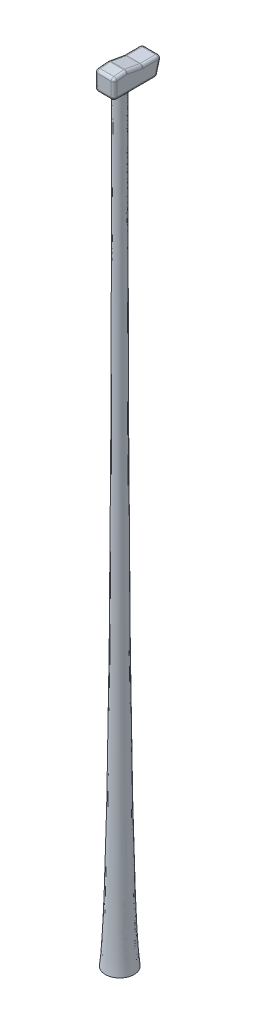
ISO-10303-21;
HEADER;
FILE_DESCRIPTION(('STEP AP214'),'2;1');
FILE_NAME('part.step','',(''),(''),'','','');
FILE_SCHEMA(('AUTOMOTIVE_DESIGN { 1 0 10303 214 1 1 1 1 }'));
ENDSEC;
DATA;
#1=APPLICATION_CONTEXT('core data for automotive mechanical design processes');
#2=APPLICATION_PROTOCOL_DEFINITION('international standard','automotive_design',2000,#1);
#3=PRODUCT_CONTEXT('',#1,'mechanical');
#4=PRODUCT('Part','Part','',(#3));
#5=PRODUCT_RELATED_PRODUCT_CATEGORY('part','',(#4));
#6=PRODUCT_DEFINITION_FORMATION('','',#4);
#7=PRODUCT_DEFINITION_CONTEXT('part definition',#1,'design');
#8=PRODUCT_DEFINITION('design','',#6,#7);
#9=PRODUCT_DEFINITION_SHAPE('','',#8);
#10=(LENGTH_UNIT() NAMED_UNIT(*) SI_UNIT(.MILLI.,.METRE.));
#11=(NAMED_UNIT(*) PLANE_ANGLE_UNIT() SI_UNIT($,.RADIAN.));
#12=(NAMED_UNIT(*) SI_UNIT($,.STERADIAN.) SOLID_ANGLE_UNIT());
#13=UNCERTAINTY_MEASURE_WITH_UNIT(LENGTH_MEASURE(1.E-05),#10,'distance_accuracy_value','');
#14=(GEOMETRIC_REPRESENTATION_CONTEXT(3) GLOBAL_UNCERTAINTY_ASSIGNED_CONTEXT((#13)) GLOBAL_UNIT_ASSIGNED_CONTEXT((#10,
#11,#12)) REPRESENTATION_CONTEXT('',''));
#15=CARTESIAN_POINT('',(0.,0.,0.));
#16=DIRECTION('',(0.,0.,1.));
#17=DIRECTION('',(1.,0.,0.));
#18=AXIS2_PLACEMENT_3D('',#15,#16,#17);
#19=CARTESIAN_POINT('',(-1000.,-999.999999999999,-5010.41122648025));
#20=DIRECTION('',(0.,-1.,0.));
#21=DIRECTION('',(0.,0.,-1.));
#22=AXIS2_PLACEMENT_3D('',#19,#20,#21);
#23=PLANE('',#22);
#24=CARTESIAN_POINT('',(0.,-1000.,-2100.));
#25=DIRECTION('',(0.,-1.,0.));
#26=DIRECTION('',(0.,0.,-1.));
#27=AXIS2_PLACEMENT_3D('',#24,#25,#26);
#28=CIRCLE('',#27,700.);
#29=CARTESIAN_POINT('',(700.,-1000.,-2100.));
#30=VERTEX_POINT('',#29);
#31=CARTESIAN_POINT('',(-700.,-1000.,-2100.));
#32=VERTEX_POINT('',#31);
#33=EDGE_CURVE('E190',#30,#32,#28,.T.);
#34=ORIENTED_EDGE('',*,*,#33,.F.);
#35=DIRECTION('',(0.,0.,-1.));
#36=VECTOR('',#35,1.);
#37=CARTESIAN_POINT('',(700.,-1000.,-500.));
#38=LINE('',#37,#36);
#39=CARTESIAN_POINT('',(700.,-1000.,-800.));
#40=VERTEX_POINT('',#39);
#41=EDGE_CURVE('E178',#30,#40,#38,.F.);
#42=ORIENTED_EDGE('',*,*,#41,.T.);
#43=DIRECTION('',(1.,0.,0.));
#44=VECTOR('',#43,1.);
#45=CARTESIAN_POINT('',(-1000.,-1000.,-800.));
#46=LINE('',#45,#44);
#47=CARTESIAN_POINT('',(-700.,-1000.,-800.));
#48=VERTEX_POINT('',#47);
#49=EDGE_CURVE('E177',#40,#48,#46,.F.);
#50=ORIENTED_EDGE('',*,*,#49,.T.);
#51=DIRECTION('',(0.,0.,-1.));
#52=VECTOR('',#51,1.);
#53=CARTESIAN_POINT('',(-700.,-999.999999999999,-5010.41122648025));
#54=LINE('',#53,#52);
#55=EDGE_CURVE('E192',#48,#32,#54,.T.);
#56=ORIENTED_EDGE('',*,*,#55,.T.);
#57=EDGE_LOOP('',(#34,#42,#50,#56));
#58=FACE_BOUND('',#57,.T.);
#59=ADVANCED_FACE('F33',(#58),#23,.T.);
#60=EDGE_CURVE('E48',#32,#30,#28,.T.);
#61=ORIENTED_EDGE('',*,*,#60,.F.);
#62=CARTESIAN_POINT('',(-700.,-999.999999999999,-4780.21313008656));
#63=VERTEX_POINT('',#62);
#64=EDGE_CURVE('E205',#32,#63,#54,.T.);
#65=ORIENTED_EDGE('',*,*,#64,.T.);
#66=DIRECTION('',(1.,0.,0.));
#67=VECTOR('',#66,1.);
#68=CARTESIAN_POINT('',(-1000.,-999.999999999999,-4780.21313008656));
#69=LINE('',#68,#67);
#70=CARTESIAN_POINT('',(700.,-999.999999999999,-4780.21313008656));
#71=VERTEX_POINT('',#70);
#72=EDGE_CURVE('E174',#63,#71,#69,.T.);
#73=ORIENTED_EDGE('',*,*,#72,.T.);
#74=EDGE_CURVE('E170',#71,#30,#38,.F.);
#75=ORIENTED_EDGE('',*,*,#74,.T.);
#76=EDGE_LOOP('',(#61,#65,#73,#75));
#77=FACE_BOUND('',#76,.T.);
#78=ADVANCED_FACE('F172',(#77),#23,.T.);
#79=CARTESIAN_POINT('',(-1000.,-1000.,-500.));
#80=DIRECTION('',(0.,0.,1.));
#81=DIRECTION('',(1.,0.,0.));
#82=AXIS2_PLACEMENT_3D('',#79,#80,#81);
#83=PLANE('',#82);
#84=DIRECTION('',(1.,0.,0.));
#85=VECTOR('',#84,1.);
#86=CARTESIAN_POINT('',(-1000.,725.100647794772,-500.));
#87=LINE('',#86,#85);
#88=CARTESIAN_POINT('',(700.,725.100647794772,-500.));
#89=VERTEX_POINT('',#88);
#90=CARTESIAN_POINT('',(-700.,725.100647794772,-500.));
#91=VERTEX_POINT('',#90);
#92=EDGE_CURVE('E233',#89,#91,#87,.F.);
#93=ORIENTED_EDGE('',*,*,#92,.T.);
#94=DIRECTION('',(0.,-1.,0.));
#95=VECTOR('',#94,1.);
#96=CARTESIAN_POINT('',(-700.,-1000.,-500.));
#97=LINE('',#96,#95);
#98=CARTESIAN_POINT('',(-700.,-700.,-500.));
#99=VERTEX_POINT('',#98);
#100=EDGE_CURVE('E239',#91,#99,#97,.T.);
#101=ORIENTED_EDGE('',*,*,#100,.T.);
#102=DIRECTION('',(1.,0.,0.));
#103=VECTOR('',#102,1.);
#104=CARTESIAN_POINT('',(-1000.,-700.,-500.));
#105=LINE('',#104,#103);
#106=CARTESIAN_POINT('',(700.,-700.,-500.));
#107=VERTEX_POINT('',#106);
#108=EDGE_CURVE('E237',#99,#107,#105,.T.);
#109=ORIENTED_EDGE('',*,*,#108,.T.);
#110=DIRECTION('',(0.,-1.,0.));
#111=VECTOR('',#110,1.);
#112=CARTESIAN_POINT('',(700.,1000.,-500.));
#113=LINE('',#112,#111);
#114=EDGE_CURVE('E235',#107,#89,#113,.F.);
#115=ORIENTED_EDGE('',*,*,#114,.T.);
#116=EDGE_LOOP('',(#93,#101,#109,#115));
#117=FACE_BOUND('',#116,.T.);
#118=ADVANCED_FACE('F404',(#117),#83,.T.);
#119=CARTESIAN_POINT('',(-1000.,1000.,-500.));
#120=DIRECTION('',(0.,0.996194698091746,0.0871557427476548));
#121=DIRECTION('',(0.,-0.0871557427476548,0.996194698091746));
#122=AXIS2_PLACEMENT_3D('',#119,#120,#121);
#123=PLANE('',#122);
#124=DIRECTION('',(1.,0.,0.));
#125=VECTOR('',#124,1.);
#126=CARTESIAN_POINT('',(-1000.,1114.66741439645,-1810.65454397387));
#127=LINE('',#126,#125);
#128=CARTESIAN_POINT('',(700.,1114.66741439645,-1810.65454397387));
#129=VERTEX_POINT('',#128);
#130=CARTESIAN_POINT('',(-700.,1114.66741439645,-1810.65454397387));
#131=VERTEX_POINT('',#130);
#132=EDGE_CURVE('E56',#129,#131,#127,.F.);
#133=ORIENTED_EDGE('',*,*,#132,.T.);
#134=DIRECTION('',(0.,-0.0871557427476548,0.996194698091746));
#135=VECTOR('',#134,1.);
#136=CARTESIAN_POINT('',(-700.,1000.,-500.));
#137=LINE('',#136,#135);
#138=CARTESIAN_POINT('',(-700.,1023.9590572223,-773.853277175704));
#139=VERTEX_POINT('',#138);
#140=EDGE_CURVE('E281',#131,#139,#137,.T.);
#141=ORIENTED_EDGE('',*,*,#140,.T.);
#142=DIRECTION('',(1.,0.,0.));
#143=VECTOR('',#142,1.);
#144=CARTESIAN_POINT('',(-1000.,1023.9590572223,-773.853277175704));
#145=LINE('',#144,#143);
#146=CARTESIAN_POINT('',(700.,1023.9590572223,-773.853277175704));
#147=VERTEX_POINT('',#146);
#148=EDGE_CURVE('E276',#139,#147,#145,.T.);
#149=ORIENTED_EDGE('',*,*,#148,.T.);
#150=DIRECTION('',(0.,-0.0871557427476548,0.996194698091746));
#151=VECTOR('',#150,1.);
#152=CARTESIAN_POINT('',(700.,1118.10969575999,-1850.));
#153=LINE('',#152,#151);
#154=EDGE_CURVE('E278',#147,#129,#153,.F.);
#155=ORIENTED_EDGE('',*,*,#154,.T.);
#156=EDGE_LOOP('',(#133,#141,#149,#155));
#157=FACE_BOUND('',#156,.T.);
#158=ADVANCED_FACE('F408',(#157),#123,.T.);
#159=CARTESIAN_POINT('',(-1000.,1118.10969575999,-1850.));
#160=DIRECTION('',(0.,0.984807753012208,-0.173648177666934));
#161=DIRECTION('',(0.,0.173648177666934,0.984807753012208));
#162=AXIS2_PLACEMENT_3D('',#159,#160,#161);
#163=PLANE('',#162);
#164=DIRECTION('',(1.,0.,0.));
#165=VECTOR('',#164,1.);
#166=CARTESIAN_POINT('',(-1000.,831.727851687357,-3474.1521457577));
#167=LINE('',#166,#165);
#168=CARTESIAN_POINT('',(700.,831.727851687357,-3474.1521457577));
#169=VERTEX_POINT('',#168);
#170=CARTESIAN_POINT('',(-700.,831.727851687357,-3474.1521457577));
#171=VERTEX_POINT('',#170);
#172=EDGE_CURVE('E271',#169,#171,#167,.F.);
#173=ORIENTED_EDGE('',*,*,#172,.T.);
#174=DIRECTION('',(0.,0.173648177666934,0.984807753012208));
#175=VECTOR('',#174,1.);
#176=CARTESIAN_POINT('',(-700.,1118.10969575999,-1850.));
#177=LINE('',#176,#175);
#178=CARTESIAN_POINT('',(-700.,1111.25133087259,-1888.89572009825));
#179=VERTEX_POINT('',#178);
#180=EDGE_CURVE('E273',#171,#179,#177,.T.);
#181=ORIENTED_EDGE('',*,*,#180,.T.);
#182=DIRECTION('',(1.,0.,0.));
#183=VECTOR('',#182,1.);
#184=CARTESIAN_POINT('',(-1000.,1111.25133087259,-1888.89572009825));
#185=LINE('',#184,#183);
#186=CARTESIAN_POINT('',(700.,1111.25133087259,-1888.89572009825));
#187=VERTEX_POINT('',#186);
#188=EDGE_CURVE('E267',#179,#187,#185,.T.);
#189=ORIENTED_EDGE('',*,*,#188,.T.);
#190=DIRECTION('',(0.,0.173648177666934,0.984807753012208));
#191=VECTOR('',#190,1.);
#192=CARTESIAN_POINT('',(700.,827.170177591019,-3500.));
#193=LINE('',#192,#191);
#194=EDGE_CURVE('E269',#187,#169,#193,.F.);
#195=ORIENTED_EDGE('',*,*,#194,.T.);
#196=EDGE_LOOP('',(#173,#181,#189,#195));
#197=FACE_BOUND('',#196,.T.);
#198=ADVANCED_FACE('F414',(#197),#163,.T.);
#199=CARTESIAN_POINT('',(-1000.,827.170177591019,-3500.));
#200=DIRECTION('',(0.,1.,0.));
#201=DIRECTION('',(0.,0.,1.));
#202=AXIS2_PLACEMENT_3D('',#199,#200,#201);
#203=PLANE('',#202);
#204=DIRECTION('',(1.,0.,0.));
#205=VECTOR('',#204,1.);
#206=CARTESIAN_POINT('',(-1000.,827.170177591019,-5109.03238814764));
#207=LINE('',#206,#205);
#208=CARTESIAN_POINT('',(700.,827.170177591019,-5109.03238814764));
#209=VERTEX_POINT('',#208);
#210=CARTESIAN_POINT('',(-700.,827.170177591019,-5109.03238814764));
#211=VERTEX_POINT('',#210);
#212=EDGE_CURVE('E262',#209,#211,#207,.F.);
#213=ORIENTED_EDGE('',*,*,#212,.T.);
#214=DIRECTION('',(0.,0.,1.));
#215=VECTOR('',#214,1.);
#216=CARTESIAN_POINT('',(-700.,827.170177591019,-3500.));
#217=LINE('',#216,#215);
#218=CARTESIAN_POINT('',(-700.,827.170177591019,-3526.24659905778));
#219=VERTEX_POINT('',#218);
#220=EDGE_CURVE('E264',#211,#219,#217,.T.);
#221=ORIENTED_EDGE('',*,*,#220,.T.);
#222=DIRECTION('',(1.,0.,0.));
#223=VECTOR('',#222,1.);
#224=CARTESIAN_POINT('',(1000.,827.170177591019,-3526.24659905778));
#225=LINE('',#224,#223);
#226=CARTESIAN_POINT('',(700.,827.170177591019,-3526.24659905778));
#227=VERTEX_POINT('',#226);
#228=EDGE_CURVE('E258',#219,#227,#225,.T.);
#229=ORIENTED_EDGE('',*,*,#228,.T.);
#230=DIRECTION('',(0.,0.,1.));
#231=VECTOR('',#230,1.);
#232=CARTESIAN_POINT('',(700.,827.170177591019,-5500.));
#233=LINE('',#232,#231);
#234=EDGE_CURVE('E260',#227,#209,#233,.F.);
#235=ORIENTED_EDGE('',*,*,#234,.T.);
#236=EDGE_LOOP('',(#213,#221,#229,#235));
#237=FACE_BOUND('',#236,.T.);
#238=ADVANCED_FACE('F422',(#237),#203,.T.);
#239=CARTESIAN_POINT('',(-1000.,827.170177591019,-5500.));
#240=DIRECTION('',(0.,-0.258819045102525,-0.965925826289067));
#241=DIRECTION('',(0.,0.965925826289067,-0.258819045102525));
#242=AXIS2_PLACEMENT_3D('',#239,#240,#241);
#243=PLANE('',#242);
#244=DIRECTION('',(0.,0.965925826289067,-0.258819045102525));
#245=VECTOR('',#244,1.);
#246=CARTESIAN_POINT('',(700.,-999.999999999999,-5010.41122648025));
#247=LINE('',#246,#245);
#248=CARTESIAN_POINT('',(700.,449.524464060261,-5398.81013603436));
#249=VERTEX_POINT('',#248);
#250=CARTESIAN_POINT('',(700.,-777.645713530757,-5069.99087797328));
#251=VERTEX_POINT('',#250);
#252=EDGE_CURVE('E210',#249,#251,#247,.F.);
#253=ORIENTED_EDGE('',*,*,#252,.T.);
#254=DIRECTION('',(1.,0.,0.));
#255=VECTOR('',#254,1.);
#256=CARTESIAN_POINT('',(-1000.,-777.645713530757,-5069.99087797328));
#257=LINE('',#256,#255);
#258=CARTESIAN_POINT('',(-700.,-777.645713530757,-5069.99087797328));
#259=VERTEX_POINT('',#258);
#260=EDGE_CURVE('E214',#251,#259,#257,.F.);
#261=ORIENTED_EDGE('',*,*,#260,.T.);
#262=DIRECTION('',(0.,0.965925826289067,-0.258819045102525));
#263=VECTOR('',#262,1.);
#264=CARTESIAN_POINT('',(-700.,827.170177591019,-5500.));
#265=LINE('',#264,#263);
#266=CARTESIAN_POINT('',(-700.,449.524464060261,-5398.81013603436));
#267=VERTEX_POINT('',#266);
#268=EDGE_CURVE('E212',#259,#267,#265,.T.);
#269=ORIENTED_EDGE('',*,*,#268,.T.);
#270=DIRECTION('',(1.,0.,0.));
#271=VECTOR('',#270,1.);
#272=CARTESIAN_POINT('',(-1000.,449.524464060261,-5398.81013603436));
#273=LINE('',#272,#271);
#274=EDGE_CURVE('E208',#267,#249,#273,.T.);
#275=ORIENTED_EDGE('',*,*,#274,.T.);
#276=EDGE_LOOP('',(#253,#261,#269,#275));
#277=FACE_BOUND('',#276,.T.);
#278=ADVANCED_FACE('F425',(#277),#243,.T.);
#279=CARTESIAN_POINT('',(-1000.,0.,0.));
#280=DIRECTION('',(-1.,0.,0.));
#281=DIRECTION('',(0.,0.,1.));
#282=AXIS2_PLACEMENT_3D('',#279,#280,#281);
#283=PLANE('',#282);
#284=CARTESIAN_POINT('',(-1000.,1127.17017759102,-3526.24659905778));
#285=DIRECTION('',(-1.,0.,0.));
#286=DIRECTION('',(0.,0.,1.));
#287=AXIS2_PLACEMENT_3D('',#284,#285,#286);
#288=CIRCLE('',#287,600.);
#289=CARTESIAN_POINT('',(-1000.,527.170177591019,-3526.24659905778));
#290=VERTEX_POINT('',#289);
#291=CARTESIAN_POINT('',(-1000.,536.285525783695,-3422.05769245762));
#292=VERTEX_POINT('',#291);
#293=EDGE_CURVE('E228',#290,#292,#288,.T.);
#294=ORIENTED_EDGE('',*,*,#293,.F.);
#295=DIRECTION('',(0.,0.,1.));
#296=VECTOR('',#295,1.);
#297=CARTESIAN_POINT('',(-1000.,527.170177591019,0.));
#298=LINE('',#297,#296);
#299=CARTESIAN_POINT('',(-1000.,527.170177591019,-5109.03238814764));
#300=VERTEX_POINT('',#299);
#301=EDGE_CURVE('E231',#290,#300,#298,.F.);
#302=ORIENTED_EDGE('',*,*,#301,.T.);
#303=DIRECTION('',(0.,0.965925826289067,-0.258819045102525));
#304=VECTOR('',#303,1.);
#305=CARTESIAN_POINT('',(-1000.,-1241.94439119711,-4634.99956812272));
#306=LINE('',#305,#304);
#307=CARTESIAN_POINT('',(-1000.,-700.,-4780.21313008656));
#308=VERTEX_POINT('',#307);
#309=EDGE_CURVE('E225',#300,#308,#306,.F.);
#310=ORIENTED_EDGE('',*,*,#309,.T.);
#311=DIRECTION('',(0.,0.,-1.));
#312=VECTOR('',#311,1.);
#313=CARTESIAN_POINT('',(-1000.,-700.,0.));
#314=LINE('',#313,#312);
#315=CARTESIAN_POINT('',(-1000.,-700.,-800.));
#316=VERTEX_POINT('',#315);
#317=EDGE_CURVE('E223',#308,#316,#314,.F.);
#318=ORIENTED_EDGE('',*,*,#317,.T.);
#319=DIRECTION('',(0.,-1.,0.));
#320=VECTOR('',#319,1.);
#321=CARTESIAN_POINT('',(-1000.,0.,-800.));
#322=LINE('',#321,#320);
#323=CARTESIAN_POINT('',(-1000.,725.100647794772,-800.));
#324=VERTEX_POINT('',#323);
#325=EDGE_CURVE('E221',#316,#324,#322,.F.);
#326=ORIENTED_EDGE('',*,*,#325,.T.);
#327=DIRECTION('',(0.,-0.0871557427476548,0.996194698091746));
#328=VECTOR('',#327,1.);
#329=CARTESIAN_POINT('',(-1000.,650.13342266185,56.8793042622177));
#330=LINE('',#329,#328);
#331=CARTESIAN_POINT('',(-1000.,815.809004968925,-1836.80126679817));
#332=VERTEX_POINT('',#331);
#333=EDGE_CURVE('E217',#324,#332,#330,.F.);
#334=ORIENTED_EDGE('',*,*,#333,.T.);
#335=DIRECTION('',(0.,0.173648177666934,0.984807753012208));
#336=VECTOR('',#335,1.);
#337=CARTESIAN_POINT('',(-1000.,1105.32086972,-194.897891671787));
#338=LINE('',#337,#336);
#339=EDGE_CURVE('E219',#332,#292,#338,.F.);
#340=ORIENTED_EDGE('',*,*,#339,.T.);
#341=EDGE_LOOP('',(#294,#302,#310,#318,#326,#334,#340));
#342=FACE_BOUND('',#341,.T.);
#343=ADVANCED_FACE('F417',(#342),#283,.T.);
#344=CARTESIAN_POINT('',(1000.,0.,0.));
#345=DIRECTION('',(-1.,0.,0.));
#346=DIRECTION('',(0.,0.,1.));
#347=AXIS2_PLACEMENT_3D('',#344,#345,#346);
#348=PLANE('',#347);
#349=DIRECTION('',(0.,-1.,0.));
#350=VECTOR('',#349,1.);
#351=CARTESIAN_POINT('',(1000.,-1000.,-800.));
#352=LINE('',#351,#350);
#353=CARTESIAN_POINT('',(1000.,725.100647794772,-800.));
#354=VERTEX_POINT('',#353);
#355=CARTESIAN_POINT('',(1000.,-700.,-800.));
#356=VERTEX_POINT('',#355);
#357=EDGE_CURVE('E253',#354,#356,#352,.T.);
#358=ORIENTED_EDGE('',*,*,#357,.T.);
#359=DIRECTION('',(0.,0.,-1.));
#360=VECTOR('',#359,1.);
#361=CARTESIAN_POINT('',(1000.,-700.,-5010.41122648025));
#362=LINE('',#361,#360);
#363=CARTESIAN_POINT('',(1000.,-700.,-4780.21313008656));
#364=VERTEX_POINT('',#363);
#365=EDGE_CURVE('E256',#356,#364,#362,.T.);
#366=ORIENTED_EDGE('',*,*,#365,.T.);
#367=DIRECTION('',(0.,0.965925826289067,-0.258819045102525));
#368=VECTOR('',#367,1.);
#369=CARTESIAN_POINT('',(1000.,904.815891121777,-5210.22225211328));
#370=LINE('',#369,#368);
#371=CARTESIAN_POINT('',(1000.,527.170177591019,-5109.03238814764));
#372=VERTEX_POINT('',#371);
#373=EDGE_CURVE('E251',#364,#372,#370,.T.);
#374=ORIENTED_EDGE('',*,*,#373,.T.);
#375=DIRECTION('',(0.,0.,1.));
#376=VECTOR('',#375,1.);
#377=CARTESIAN_POINT('',(1000.,527.170177591019,-3500.));
#378=LINE('',#377,#376);
#379=CARTESIAN_POINT('',(1000.,527.170177591019,-3526.24659905778));
#380=VERTEX_POINT('',#379);
#381=EDGE_CURVE('E249',#372,#380,#378,.T.);
#382=ORIENTED_EDGE('',*,*,#381,.T.);
#383=CARTESIAN_POINT('',(1000.,1127.17017759102,-3526.24659905778));
#384=DIRECTION('',(-1.,0.,0.));
#385=DIRECTION('',(0.,0.,1.));
#386=AXIS2_PLACEMENT_3D('',#383,#384,#385);
#387=CIRCLE('',#386,600.);
#388=CARTESIAN_POINT('',(1000.,536.285525783695,-3422.05769245762));
#389=VERTEX_POINT('',#388);
#390=EDGE_CURVE('E246',#389,#380,#387,.F.);
#391=ORIENTED_EDGE('',*,*,#390,.F.);
#392=DIRECTION('',(0.,0.173648177666934,0.984807753012208));
#393=VECTOR('',#392,1.);
#394=CARTESIAN_POINT('',(1000.,822.667369856331,-1797.90554669992));
#395=LINE('',#394,#393);
#396=CARTESIAN_POINT('',(1000.,815.809004968925,-1836.80126679817));
#397=VERTEX_POINT('',#396);
#398=EDGE_CURVE('E244',#389,#397,#395,.T.);
#399=ORIENTED_EDGE('',*,*,#398,.T.);
#400=DIRECTION('',(0.,-0.0871557427476548,0.996194698091746));
#401=VECTOR('',#400,1.);
#402=CARTESIAN_POINT('',(1000.,701.141590572476,-526.146722824296));
#403=LINE('',#402,#401);
#404=EDGE_CURVE('E242',#397,#354,#403,.T.);
#405=ORIENTED_EDGE('',*,*,#404,.T.);
#406=EDGE_LOOP('',(#358,#366,#374,#382,#391,#399,#405));
#407=FACE_BOUND('',#406,.T.);
#408=ADVANCED_FACE('F432',(#407),#348,.F.);
#409=CARTESIAN_POINT('',(-1000.,815.809004968925,-1836.80126679817));
#410=DIRECTION('',(1.,0.,0.));
#411=DIRECTION('',(0.,0.,-1.));
#412=AXIS2_PLACEMENT_3D('',#409,#410,#411);
#413=CYLINDRICAL_SURFACE('',#412,300.);
#414=CARTESIAN_POINT('',(-700.,815.809004968925,-1836.80126679817));
#415=DIRECTION('',(-1.,0.,0.));
#416=DIRECTION('',(0.,0.,1.));
#417=AXIS2_PLACEMENT_3D('',#414,#415,#416);
#418=CIRCLE('',#417,300.);
#419=EDGE_CURVE('E187',#131,#179,#418,.T.);
#420=ORIENTED_EDGE('',*,*,#419,.F.);
#421=ORIENTED_EDGE('',*,*,#132,.F.);
#422=CARTESIAN_POINT('',(700.,815.809004968925,-1836.80126679817));
#423=DIRECTION('',(1.,0.,0.));
#424=DIRECTION('',(0.,0.,-1.));
#425=AXIS2_PLACEMENT_3D('',#422,#423,#424);
#426=CIRCLE('',#425,300.);
#427=EDGE_CURVE('E375',#187,#129,#426,.T.);
#428=ORIENTED_EDGE('',*,*,#427,.F.);
#429=ORIENTED_EDGE('',*,*,#188,.F.);
#430=EDGE_LOOP('',(#420,#421,#428,#429));
#431=FACE_BOUND('',#430,.T.);
#432=ADVANCED_FACE('F35',(#431),#413,.T.);
#433=CARTESIAN_POINT('',(-700.,815.809004968925,-1836.80126679817));
#434=DIRECTION('',(-1.,0.,0.));
#435=DIRECTION('',(0.,0.,1.));
#436=AXIS2_PLACEMENT_3D('',#433,#434,#435);
#437=SPHERICAL_SURFACE('',#436,300.);
#438=CARTESIAN_POINT('',(-700.,815.809004968925,-1836.80126679817));
#439=DIRECTION('',(0.,0.087155742747654,-0.996194698091746));
#440=DIRECTION('',(0.,0.996194698091746,0.087155742747654));
#441=AXIS2_PLACEMENT_3D('',#438,#439,#440);
#442=CIRCLE('',#441,300.);
#443=EDGE_CURVE('E370',#131,#332,#442,.F.);
#444=ORIENTED_EDGE('',*,*,#443,.F.);
#445=ORIENTED_EDGE('',*,*,#419,.T.);
#446=CARTESIAN_POINT('',(-700.,815.809004968925,-1836.80126679817));
#447=DIRECTION('',(0.,0.173648177666934,0.984807753012207));
#448=DIRECTION('',(0.,-0.984807753012208,0.173648177666934));
#449=AXIS2_PLACEMENT_3D('',#446,#447,#448);
#450=CIRCLE('',#449,300.);
#451=EDGE_CURVE('E373',#332,#179,#450,.F.);
#452=ORIENTED_EDGE('',*,*,#451,.F.);
#453=EDGE_LOOP('',(#444,#445,#452));
#454=FACE_BOUND('',#453,.T.);
#455=ADVANCED_FACE('F580',(#454),#437,.T.);
#456=CARTESIAN_POINT('',(700.,815.809004968925,-1836.80126679817));
#457=DIRECTION('',(1.,0.,0.));
#458=DIRECTION('',(0.,0.,-1.));
#459=AXIS2_PLACEMENT_3D('',#456,#457,#458);
#460=SPHERICAL_SURFACE('',#459,300.);
#461=CARTESIAN_POINT('',(700.,815.809004968925,-1836.80126679817));
#462=DIRECTION('',(0.,0.173648177666933,0.984807753012208));
#463=DIRECTION('',(0.,-0.984807753012208,0.173648177666933));
#464=AXIS2_PLACEMENT_3D('',#461,#462,#463);
#465=CIRCLE('',#464,300.);
#466=EDGE_CURVE('E364',#187,#397,#465,.F.);
#467=ORIENTED_EDGE('',*,*,#466,.F.);
#468=ORIENTED_EDGE('',*,*,#427,.T.);
#469=CARTESIAN_POINT('',(700.,815.809004968925,-1836.80126679817));
#470=DIRECTION('',(0.,0.0871557427476547,-0.996194698091746));
#471=DIRECTION('',(0.,0.996194698091746,0.0871557427476547));
#472=AXIS2_PLACEMENT_3D('',#469,#470,#471);
#473=CIRCLE('',#472,300.);
#474=EDGE_CURVE('E367',#397,#129,#473,.F.);
#475=ORIENTED_EDGE('',*,*,#474,.F.);
#476=EDGE_LOOP('',(#467,#468,#475));
#477=FACE_BOUND('',#476,.T.);
#478=ADVANCED_FACE('F577',(#477),#460,.T.);
#479=CARTESIAN_POINT('',(-700.,822.667369856331,-1797.90554669992));
#480=DIRECTION('',(0.,0.173648177666934,0.984807753012208));
#481=DIRECTION('',(0.,-0.984807753012208,0.173648177666934));
#482=AXIS2_PLACEMENT_3D('',#479,#480,#481);
#483=CYLINDRICAL_SURFACE('',#482,300.);
#484=ORIENTED_EDGE('',*,*,#451,.T.);
#485=ORIENTED_EDGE('',*,*,#180,.F.);
#486=CARTESIAN_POINT('',(-700.,536.285525783695,-3422.05769245762));
#487=DIRECTION('',(0.,-0.173648177666933,-0.984807753012208));
#488=DIRECTION('',(0.,0.984807753012208,-0.173648177666933));
#489=AXIS2_PLACEMENT_3D('',#486,#487,#488);
#490=CIRCLE('',#489,300.);
#491=EDGE_CURVE('E358',#292,#171,#490,.T.);
#492=ORIENTED_EDGE('',*,*,#491,.F.);
#493=ORIENTED_EDGE('',*,*,#339,.F.);
#494=EDGE_LOOP('',(#484,#485,#492,#493));
#495=FACE_BOUND('',#494,.T.);
#496=ADVANCED_FACE('F573',(#495),#483,.T.);
#497=CARTESIAN_POINT('',(-700.,701.141590572476,-526.146722824296));
#498=DIRECTION('',(0.,-0.0871557427476548,0.996194698091746));
#499=DIRECTION('',(0.,-0.996194698091746,-0.0871557427476548));
#500=AXIS2_PLACEMENT_3D('',#497,#498,#499);
#501=CYLINDRICAL_SURFACE('',#500,300.);
#502=ORIENTED_EDGE('',*,*,#443,.T.);
#503=ORIENTED_EDGE('',*,*,#333,.F.);
#504=CARTESIAN_POINT('',(-700.,725.100647794772,-800.));
#505=DIRECTION('',(0.,-0.0871557427476547,0.996194698091746));
#506=DIRECTION('',(0.,-0.996194698091746,-0.0871557427476547));
#507=AXIS2_PLACEMENT_3D('',#504,#505,#506);
#508=CIRCLE('',#507,300.);
#509=EDGE_CURVE('E355',#139,#324,#508,.T.);
#510=ORIENTED_EDGE('',*,*,#509,.F.);
#511=ORIENTED_EDGE('',*,*,#140,.F.);
#512=EDGE_LOOP('',(#502,#503,#510,#511));
#513=FACE_BOUND('',#512,.T.);
#514=ADVANCED_FACE('F570',(#513),#501,.T.);
#515=CARTESIAN_POINT('',(-1000.,725.100647794772,-800.));
#516=DIRECTION('',(1.,0.,0.));
#517=DIRECTION('',(0.,0.,-1.));
#518=AXIS2_PLACEMENT_3D('',#515,#516,#517);
#519=CYLINDRICAL_SURFACE('',#518,300.);
#520=CARTESIAN_POINT('',(700.,725.100647794772,-800.));
#521=DIRECTION('',(1.,0.,0.));
#522=DIRECTION('',(0.,0.,-1.));
#523=AXIS2_PLACEMENT_3D('',#520,#521,#522);
#524=CIRCLE('',#523,300.);
#525=EDGE_CURVE('E350',#147,#89,#524,.T.);
#526=ORIENTED_EDGE('',*,*,#525,.F.);
#527=ORIENTED_EDGE('',*,*,#148,.F.);
#528=CARTESIAN_POINT('',(-700.,725.100647794772,-800.));
#529=DIRECTION('',(-1.,0.,0.));
#530=DIRECTION('',(0.,0.,1.));
#531=AXIS2_PLACEMENT_3D('',#528,#529,#530);
#532=CIRCLE('',#531,300.);
#533=EDGE_CURVE('E353',#91,#139,#532,.T.);
#534=ORIENTED_EDGE('',*,*,#533,.F.);
#535=ORIENTED_EDGE('',*,*,#92,.F.);
#536=EDGE_LOOP('',(#526,#527,#534,#535));
#537=FACE_BOUND('',#536,.T.);
#538=ADVANCED_FACE('F470',(#537),#519,.T.);
#539=CARTESIAN_POINT('',(700.,650.13342266185,56.8793042622177));
#540=DIRECTION('',(0.,0.0871557427476548,-0.996194698091746));
#541=DIRECTION('',(0.,0.996194698091746,0.0871557427476548));
#542=AXIS2_PLACEMENT_3D('',#539,#540,#541);
#543=CYLINDRICAL_SURFACE('',#542,300.);
#544=ORIENTED_EDGE('',*,*,#474,.T.);
#545=ORIENTED_EDGE('',*,*,#154,.F.);
#546=CARTESIAN_POINT('',(700.,725.100647794772,-800.));
#547=DIRECTION('',(0.,-0.0871557427476547,0.996194698091746));
#548=DIRECTION('',(0.,-0.996194698091746,-0.0871557427476547));
#549=AXIS2_PLACEMENT_3D('',#546,#547,#548);
#550=CIRCLE('',#549,300.);
#551=EDGE_CURVE('E347',#354,#147,#550,.T.);
#552=ORIENTED_EDGE('',*,*,#551,.F.);
#553=ORIENTED_EDGE('',*,*,#404,.F.);
#554=EDGE_LOOP('',(#544,#545,#552,#553));
#555=FACE_BOUND('',#554,.T.);
#556=ADVANCED_FACE('F463',(#555),#543,.T.);
#557=CARTESIAN_POINT('',(700.,1105.32086972,-194.897891671787));
#558=DIRECTION('',(0.,-0.173648177666934,-0.984807753012208));
#559=DIRECTION('',(0.,0.984807753012208,-0.173648177666934));
#560=AXIS2_PLACEMENT_3D('',#557,#558,#559);
#561=CYLINDRICAL_SURFACE('',#560,300.);
#562=ORIENTED_EDGE('',*,*,#466,.T.);
#563=ORIENTED_EDGE('',*,*,#398,.F.);
#564=CARTESIAN_POINT('',(700.,536.285525783695,-3422.05769245762));
#565=DIRECTION('',(0.,-0.173648177666933,-0.984807753012208));
#566=DIRECTION('',(0.,0.984807753012208,-0.173648177666933));
#567=AXIS2_PLACEMENT_3D('',#564,#565,#566);
#568=CIRCLE('',#567,300.);
#569=EDGE_CURVE('E344',#169,#389,#568,.T.);
#570=ORIENTED_EDGE('',*,*,#569,.F.);
#571=ORIENTED_EDGE('',*,*,#194,.F.);
#572=EDGE_LOOP('',(#562,#563,#570,#571));
#573=FACE_BOUND('',#572,.T.);
#574=ADVANCED_FACE('F561',(#573),#561,.T.);
#575=CARTESIAN_POINT('',(-1000.,1127.17017759102,-3526.24659905778));
#576=DIRECTION('',(-1.,0.,0.));
#577=DIRECTION('',(0.,0.,1.));
#578=AXIS2_PLACEMENT_3D('',#575,#576,#577);
#579=CYLINDRICAL_SURFACE('',#578,300.);
#580=CARTESIAN_POINT('',(-700.,1127.17017759102,-3526.24659905778));
#581=DIRECTION('',(-1.,0.,0.));
#582=DIRECTION('',(0.,0.,1.));
#583=AXIS2_PLACEMENT_3D('',#580,#581,#582);
#584=CIRCLE('',#583,300.);
#585=EDGE_CURVE('E361',#171,#219,#584,.F.);
#586=ORIENTED_EDGE('',*,*,#585,.F.);
#587=ORIENTED_EDGE('',*,*,#172,.F.);
#588=CARTESIAN_POINT('',(700.,1127.17017759102,-3526.24659905778));
#589=DIRECTION('',(-1.,0.,0.));
#590=DIRECTION('',(0.,0.,1.));
#591=AXIS2_PLACEMENT_3D('',#588,#589,#590);
#592=CIRCLE('',#591,300.);
#593=EDGE_CURVE('E341',#227,#169,#592,.T.);
#594=ORIENTED_EDGE('',*,*,#593,.F.);
#595=ORIENTED_EDGE('',*,*,#228,.F.);
#596=EDGE_LOOP('',(#586,#587,#594,#595));
#597=FACE_BOUND('',#596,.T.);
#598=ADVANCED_FACE('F557',(#597),#579,.F.);
#599=CARTESIAN_POINT('',(-700.,1127.17017759102,-3526.24659905778));
#600=DIRECTION('',(-1.,0.,0.));
#601=DIRECTION('',(0.,0.,1.));
#602=AXIS2_PLACEMENT_3D('',#599,#600,#601);
#603=TOROIDAL_SURFACE('',#602,600.,300.);
#604=ORIENTED_EDGE('',*,*,#491,.T.);
#605=ORIENTED_EDGE('',*,*,#585,.T.);
#606=CARTESIAN_POINT('',(-700.,527.170177591019,-3526.24659905778));
#607=DIRECTION('',(0.,0.,1.));
#608=DIRECTION('',(1.,0.,0.));
#609=AXIS2_PLACEMENT_3D('',#606,#607,#608);
#610=CIRCLE('',#609,300.);
#611=EDGE_CURVE('E339',#290,#219,#610,.F.);
#612=ORIENTED_EDGE('',*,*,#611,.F.);
#613=ORIENTED_EDGE('',*,*,#293,.T.);
#614=EDGE_LOOP('',(#604,#605,#612,#613));
#615=FACE_BOUND('',#614,.T.);
#616=ADVANCED_FACE('F553',(#615),#603,.T.);
#617=CARTESIAN_POINT('',(-700.,725.100647794772,-800.));
#618=DIRECTION('',(-1.,0.,0.));
#619=DIRECTION('',(0.,0.,1.));
#620=AXIS2_PLACEMENT_3D('',#617,#618,#619);
#621=SPHERICAL_SURFACE('',#620,300.);
#622=ORIENTED_EDGE('',*,*,#533,.T.);
#623=ORIENTED_EDGE('',*,*,#509,.T.);
#624=CARTESIAN_POINT('',(-700.,725.100647794772,-800.));
#625=DIRECTION('',(0.,1.,0.));
#626=DIRECTION('',(0.,0.,1.));
#627=AXIS2_PLACEMENT_3D('',#624,#625,#626);
#628=CIRCLE('',#627,300.);
#629=EDGE_CURVE('E336',#91,#324,#628,.F.);
#630=ORIENTED_EDGE('',*,*,#629,.F.);
#631=EDGE_LOOP('',(#622,#623,#630));
#632=FACE_BOUND('',#631,.T.);
#633=ADVANCED_FACE('F550',(#632),#621,.T.);
#634=CARTESIAN_POINT('',(700.,725.100647794772,-800.));
#635=DIRECTION('',(1.,0.,0.));
#636=DIRECTION('',(0.,1.,0.));
#637=AXIS2_PLACEMENT_3D('',#634,#635,#636);
#638=SPHERICAL_SURFACE('',#637,300.);
#639=ORIENTED_EDGE('',*,*,#551,.T.);
#640=ORIENTED_EDGE('',*,*,#525,.T.);
#641=CARTESIAN_POINT('',(700.,725.100647794772,-800.));
#642=DIRECTION('',(0.,1.,0.));
#643=DIRECTION('',(-1.,0.,0.));
#644=AXIS2_PLACEMENT_3D('',#641,#642,#643);
#645=CIRCLE('',#644,300.);
#646=EDGE_CURVE('E333',#354,#89,#645,.F.);
#647=ORIENTED_EDGE('',*,*,#646,.F.);
#648=EDGE_LOOP('',(#639,#640,#647));
#649=FACE_BOUND('',#648,.T.);
#650=ADVANCED_FACE('F466',(#649),#638,.T.);
#651=CARTESIAN_POINT('',(700.,1127.17017759102,-3526.24659905778));
#652=DIRECTION('',(-1.,0.,0.));
#653=DIRECTION('',(0.,0.,1.));
#654=AXIS2_PLACEMENT_3D('',#651,#652,#653);
#655=TOROIDAL_SURFACE('',#654,600.,300.);
#656=ORIENTED_EDGE('',*,*,#569,.T.);
#657=ORIENTED_EDGE('',*,*,#390,.T.);
#658=CARTESIAN_POINT('',(700.,527.170177591019,-3526.24659905778));
#659=DIRECTION('',(0.,0.,1.));
#660=DIRECTION('',(1.,0.,0.));
#661=AXIS2_PLACEMENT_3D('',#658,#659,#660);
#662=CIRCLE('',#661,300.);
#663=EDGE_CURVE('E330',#227,#380,#662,.F.);
#664=ORIENTED_EDGE('',*,*,#663,.F.);
#665=ORIENTED_EDGE('',*,*,#593,.T.);
#666=EDGE_LOOP('',(#656,#657,#664,#665));
#667=FACE_BOUND('',#666,.T.);
#668=ADVANCED_FACE('F544',(#667),#655,.T.);
#669=CARTESIAN_POINT('',(-700.,527.170177591019,-3500.));
#670=DIRECTION('',(0.,0.,1.));
#671=DIRECTION('',(0.,-1.,0.));
#672=AXIS2_PLACEMENT_3D('',#669,#670,#671);
#673=CYLINDRICAL_SURFACE('',#672,300.);
#674=ORIENTED_EDGE('',*,*,#611,.T.);
#675=ORIENTED_EDGE('',*,*,#220,.F.);
#676=CARTESIAN_POINT('',(-700.,527.170177591019,-5109.03238814764));
#677=DIRECTION('',(0.,0.,-1.));
#678=DIRECTION('',(0.,1.,0.));
#679=AXIS2_PLACEMENT_3D('',#676,#677,#678);
#680=CIRCLE('',#679,300.);
#681=EDGE_CURVE('E324',#300,#211,#680,.T.);
#682=ORIENTED_EDGE('',*,*,#681,.F.);
#683=ORIENTED_EDGE('',*,*,#301,.F.);
#684=EDGE_LOOP('',(#674,#675,#682,#683));
#685=FACE_BOUND('',#684,.T.);
#686=ADVANCED_FACE('F505',(#685),#673,.T.);
#687=CARTESIAN_POINT('',(-700.,-1000.,-800.));
#688=DIRECTION('',(0.,-1.,0.));
#689=DIRECTION('',(0.,0.,-1.));
#690=AXIS2_PLACEMENT_3D('',#687,#688,#689);
#691=CYLINDRICAL_SURFACE('',#690,300.);
#692=ORIENTED_EDGE('',*,*,#629,.T.);
#693=ORIENTED_EDGE('',*,*,#325,.F.);
#694=CARTESIAN_POINT('',(-700.,-700.,-800.));
#695=DIRECTION('',(0.,-1.,0.));
#696=DIRECTION('',(0.,0.,-1.));
#697=AXIS2_PLACEMENT_3D('',#694,#695,#696);
#698=CIRCLE('',#697,300.);
#699=EDGE_CURVE('E321',#99,#316,#698,.T.);
#700=ORIENTED_EDGE('',*,*,#699,.F.);
#701=ORIENTED_EDGE('',*,*,#100,.F.);
#702=EDGE_LOOP('',(#692,#693,#700,#701));
#703=FACE_BOUND('',#702,.T.);
#704=ADVANCED_FACE('F538',(#703),#691,.T.);
#705=CARTESIAN_POINT('',(-1000.,-700.,-800.));
#706=DIRECTION('',(1.,0.,0.));
#707=DIRECTION('',(0.,0.,-1.));
#708=AXIS2_PLACEMENT_3D('',#705,#706,#707);
#709=CYLINDRICAL_SURFACE('',#708,300.);
#710=CARTESIAN_POINT('',(700.,-700.,-800.));
#711=DIRECTION('',(1.,0.,0.));
#712=DIRECTION('',(0.,0.,-1.));
#713=AXIS2_PLACEMENT_3D('',#710,#711,#712);
#714=CIRCLE('',#713,300.);
#715=EDGE_CURVE('E316',#107,#40,#714,.T.);
#716=ORIENTED_EDGE('',*,*,#715,.F.);
#717=ORIENTED_EDGE('',*,*,#108,.F.);
#718=CARTESIAN_POINT('',(-700.,-700.,-800.));
#719=DIRECTION('',(-1.,0.,0.));
#720=DIRECTION('',(0.,0.,1.));
#721=AXIS2_PLACEMENT_3D('',#718,#719,#720);
#722=CIRCLE('',#721,300.);
#723=EDGE_CURVE('E319',#48,#99,#722,.T.);
#724=ORIENTED_EDGE('',*,*,#723,.F.);
#725=ORIENTED_EDGE('',*,*,#49,.F.);
#726=EDGE_LOOP('',(#716,#717,#724,#725));
#727=FACE_BOUND('',#726,.T.);
#728=ADVANCED_FACE('F477',(#727),#709,.T.);
#729=CARTESIAN_POINT('',(700.,0.,-800.));
#730=DIRECTION('',(0.,1.,0.));
#731=DIRECTION('',(0.,0.,1.));
#732=AXIS2_PLACEMENT_3D('',#729,#730,#731);
#733=CYLINDRICAL_SURFACE('',#732,300.);
#734=ORIENTED_EDGE('',*,*,#646,.T.);
#735=ORIENTED_EDGE('',*,*,#114,.F.);
#736=CARTESIAN_POINT('',(700.,-700.,-800.));
#737=DIRECTION('',(0.,-1.,0.));
#738=DIRECTION('',(0.,0.,-1.));
#739=AXIS2_PLACEMENT_3D('',#736,#737,#738);
#740=CIRCLE('',#739,300.);
#741=EDGE_CURVE('E313',#356,#107,#740,.T.);
#742=ORIENTED_EDGE('',*,*,#741,.F.);
#743=ORIENTED_EDGE('',*,*,#357,.F.);
#744=EDGE_LOOP('',(#734,#735,#742,#743));
#745=FACE_BOUND('',#744,.T.);
#746=ADVANCED_FACE('F456',(#745),#733,.T.);
#747=CARTESIAN_POINT('',(700.,527.170177591019,0.));
#748=DIRECTION('',(0.,0.,-1.));
#749=DIRECTION('',(0.,1.,0.));
#750=AXIS2_PLACEMENT_3D('',#747,#748,#749);
#751=CYLINDRICAL_SURFACE('',#750,300.);
#752=ORIENTED_EDGE('',*,*,#663,.T.);
#753=ORIENTED_EDGE('',*,*,#381,.F.);
#754=CARTESIAN_POINT('',(700.,527.170177591019,-5109.03238814764));
#755=DIRECTION('',(0.,0.,-1.));
#756=DIRECTION('',(-1.,0.,0.));
#757=AXIS2_PLACEMENT_3D('',#754,#755,#756);
#758=CIRCLE('',#757,300.);
#759=EDGE_CURVE('E310',#209,#372,#758,.T.);
#760=ORIENTED_EDGE('',*,*,#759,.F.);
#761=ORIENTED_EDGE('',*,*,#234,.F.);
#762=EDGE_LOOP('',(#752,#753,#760,#761));
#763=FACE_BOUND('',#762,.T.);
#764=ADVANCED_FACE('F513',(#763),#751,.T.);
#765=CARTESIAN_POINT('',(-1000.,527.170177591019,-5109.03238814764));
#766=DIRECTION('',(1.,0.,0.));
#767=DIRECTION('',(0.,0.,-1.));
#768=AXIS2_PLACEMENT_3D('',#765,#766,#767);
#769=CYLINDRICAL_SURFACE('',#768,300.);
#770=CARTESIAN_POINT('',(-700.,527.170177591019,-5109.03238814764));
#771=DIRECTION('',(-1.,0.,0.));
#772=DIRECTION('',(0.,0.,1.));
#773=AXIS2_PLACEMENT_3D('',#770,#771,#772);
#774=CIRCLE('',#773,300.);
#775=EDGE_CURVE('E327',#211,#267,#774,.T.);
#776=ORIENTED_EDGE('',*,*,#775,.F.);
#777=ORIENTED_EDGE('',*,*,#212,.F.);
#778=CARTESIAN_POINT('',(700.,527.170177591019,-5109.03238814764));
#779=DIRECTION('',(1.,0.,0.));
#780=DIRECTION('',(0.,0.,-1.));
#781=AXIS2_PLACEMENT_3D('',#778,#779,#780);
#782=CIRCLE('',#781,300.);
#783=EDGE_CURVE('E307',#249,#209,#782,.T.);
#784=ORIENTED_EDGE('',*,*,#783,.F.);
#785=ORIENTED_EDGE('',*,*,#274,.F.);
#786=EDGE_LOOP('',(#776,#777,#784,#785));
#787=FACE_BOUND('',#786,.T.);
#788=ADVANCED_FACE('F496',(#787),#769,.T.);
#789=CARTESIAN_POINT('',(-700.,527.170177591019,-5109.03238814764));
#790=DIRECTION('',(-1.,0.,0.));
#791=DIRECTION('',(0.,0.,1.));
#792=AXIS2_PLACEMENT_3D('',#789,#790,#791);
#793=SPHERICAL_SURFACE('',#792,300.);
#794=ORIENTED_EDGE('',*,*,#681,.T.);
#795=ORIENTED_EDGE('',*,*,#775,.T.);
#796=CARTESIAN_POINT('',(-700.,527.170177591019,-5109.03238814764));
#797=DIRECTION('',(0.,0.965925826289067,-0.258819045102525));
#798=DIRECTION('',(0.,0.258819045102525,0.965925826289067));
#799=AXIS2_PLACEMENT_3D('',#796,#797,#798);
#800=CIRCLE('',#799,300.);
#801=EDGE_CURVE('E304',#300,#267,#800,.F.);
#802=ORIENTED_EDGE('',*,*,#801,.F.);
#803=EDGE_LOOP('',(#794,#795,#802));
#804=FACE_BOUND('',#803,.T.);
#805=ADVANCED_FACE('F500',(#804),#793,.T.);
#806=CARTESIAN_POINT('',(-700.,-700.,-800.));
#807=DIRECTION('',(0.,0.,1.));
#808=DIRECTION('',(1.,0.,0.));
#809=AXIS2_PLACEMENT_3D('',#806,#807,#808);
#810=SPHERICAL_SURFACE('',#809,300.);
#811=ORIENTED_EDGE('',*,*,#723,.T.);
#812=ORIENTED_EDGE('',*,*,#699,.T.);
#813=CARTESIAN_POINT('',(-700.,-700.,-800.));
#814=DIRECTION('',(0.,0.,1.));
#815=DIRECTION('',(1.,0.,0.));
#816=AXIS2_PLACEMENT_3D('',#813,#814,#815);
#817=CIRCLE('',#816,300.);
#818=EDGE_CURVE('E301',#48,#316,#817,.F.);
#819=ORIENTED_EDGE('',*,*,#818,.F.);
#820=EDGE_LOOP('',(#811,#812,#819));
#821=FACE_BOUND('',#820,.T.);
#822=ADVANCED_FACE('F481',(#821),#810,.T.);
#823=CARTESIAN_POINT('',(700.,-700.,-800.));
#824=DIRECTION('',(0.,0.,1.));
#825=DIRECTION('',(1.,0.,0.));
#826=AXIS2_PLACEMENT_3D('',#823,#824,#825);
#827=SPHERICAL_SURFACE('',#826,300.);
#828=ORIENTED_EDGE('',*,*,#741,.T.);
#829=ORIENTED_EDGE('',*,*,#715,.T.);
#830=CARTESIAN_POINT('',(700.,-700.,-800.));
#831=DIRECTION('',(0.,0.,1.));
#832=DIRECTION('',(1.,0.,0.));
#833=AXIS2_PLACEMENT_3D('',#830,#831,#832);
#834=CIRCLE('',#833,300.);
#835=EDGE_CURVE('E184',#356,#40,#834,.F.);
#836=ORIENTED_EDGE('',*,*,#835,.F.);
#837=EDGE_LOOP('',(#828,#829,#836));
#838=FACE_BOUND('',#837,.T.);
#839=ADVANCED_FACE('F451',(#838),#827,.T.);
#840=CARTESIAN_POINT('',(700.,527.170177591019,-5109.03238814764));
#841=DIRECTION('',(1.,0.,0.));
#842=DIRECTION('',(0.,0.,-1.));
#843=AXIS2_PLACEMENT_3D('',#840,#841,#842);
#844=SPHERICAL_SURFACE('',#843,300.);
#845=ORIENTED_EDGE('',*,*,#783,.T.);
#846=ORIENTED_EDGE('',*,*,#759,.T.);
#847=CARTESIAN_POINT('',(700.,527.170177591019,-5109.03238814764));
#848=DIRECTION('',(0.,0.965925826289067,-0.258819045102526));
#849=DIRECTION('',(0.,0.258819045102526,0.965925826289067));
#850=AXIS2_PLACEMENT_3D('',#847,#848,#849);
#851=CIRCLE('',#850,300.);
#852=EDGE_CURVE('E297',#249,#372,#851,.F.);
#853=ORIENTED_EDGE('',*,*,#852,.F.);
#854=EDGE_LOOP('',(#845,#846,#853));
#855=FACE_BOUND('',#854,.T.);
#856=ADVANCED_FACE('F515',(#855),#844,.T.);
#857=CARTESIAN_POINT('',(-700.,904.815891121777,-5210.22225211328));
#858=DIRECTION('',(0.,0.965925826289067,-0.258819045102525));
#859=DIRECTION('',(0.,0.258819045102525,0.965925826289067));
#860=AXIS2_PLACEMENT_3D('',#857,#858,#859);
#861=CYLINDRICAL_SURFACE('',#860,300.);
#862=ORIENTED_EDGE('',*,*,#801,.T.);
#863=ORIENTED_EDGE('',*,*,#268,.F.);
#864=CARTESIAN_POINT('',(-700.,-700.,-4780.21313008656));
#865=DIRECTION('',(0.,-0.965925826289067,0.258819045102525));
#866=DIRECTION('',(0.,-0.258819045102525,-0.965925826289067));
#867=AXIS2_PLACEMENT_3D('',#864,#865,#866);
#868=CIRCLE('',#867,300.);
#869=EDGE_CURVE('E294',#308,#259,#868,.T.);
#870=ORIENTED_EDGE('',*,*,#869,.F.);
#871=ORIENTED_EDGE('',*,*,#309,.F.);
#872=EDGE_LOOP('',(#862,#863,#870,#871));
#873=FACE_BOUND('',#872,.T.);
#874=ADVANCED_FACE('F492',(#873),#861,.T.);
#875=CARTESIAN_POINT('',(-700.,-700.,-5010.41122648025));
#876=DIRECTION('',(0.,0.,-1.));
#877=DIRECTION('',(0.,1.,0.));
#878=AXIS2_PLACEMENT_3D('',#875,#876,#877);
#879=CYLINDRICAL_SURFACE('',#878,300.);
#880=ORIENTED_EDGE('',*,*,#818,.T.);
#881=ORIENTED_EDGE('',*,*,#317,.F.);
#882=CARTESIAN_POINT('',(-700.,-700.,-4780.21313008656));
#883=DIRECTION('',(0.,0.,-1.));
#884=DIRECTION('',(-1.,0.,0.));
#885=AXIS2_PLACEMENT_3D('',#882,#883,#884);
#886=CIRCLE('',#885,300.);
#887=EDGE_CURVE('E292',#63,#308,#886,.T.);
#888=ORIENTED_EDGE('',*,*,#887,.F.);
#889=ORIENTED_EDGE('',*,*,#64,.F.);
#890=ORIENTED_EDGE('',*,*,#55,.F.);
#891=EDGE_LOOP('',(#880,#881,#888,#889,#890));
#892=FACE_BOUND('',#891,.T.);
#893=ADVANCED_FACE('F484',(#892),#879,.T.);
#894=CARTESIAN_POINT('',(700.,-700.,0.));
#895=DIRECTION('',(0.,0.,1.));
#896=DIRECTION('',(0.,-1.,0.));
#897=AXIS2_PLACEMENT_3D('',#894,#895,#896);
#898=CYLINDRICAL_SURFACE('',#897,300.);
#899=ORIENTED_EDGE('',*,*,#835,.T.);
#900=ORIENTED_EDGE('',*,*,#41,.F.);
#901=ORIENTED_EDGE('',*,*,#74,.F.);
#902=CARTESIAN_POINT('',(700.,-700.,-4780.21313008656));
#903=DIRECTION('',(0.,0.,-1.));
#904=DIRECTION('',(0.,1.,0.));
#905=AXIS2_PLACEMENT_3D('',#902,#903,#904);
#906=CIRCLE('',#905,300.);
#907=EDGE_CURVE('E289',#364,#71,#906,.T.);
#908=ORIENTED_EDGE('',*,*,#907,.F.);
#909=ORIENTED_EDGE('',*,*,#365,.F.);
#910=EDGE_LOOP('',(#899,#900,#901,#908,#909));
#911=FACE_BOUND('',#910,.T.);
#912=ADVANCED_FACE('F182',(#911),#898,.T.);
#913=CARTESIAN_POINT('',(700.,-1241.94439119711,-4634.99956812272));
#914=DIRECTION('',(0.,-0.965925826289067,0.258819045102525));
#915=DIRECTION('',(0.,-0.258819045102525,-0.965925826289067));
#916=AXIS2_PLACEMENT_3D('',#913,#914,#915);
#917=CYLINDRICAL_SURFACE('',#916,300.);
#918=ORIENTED_EDGE('',*,*,#852,.T.);
#919=ORIENTED_EDGE('',*,*,#373,.F.);
#920=CARTESIAN_POINT('',(700.,-700.,-4780.21313008656));
#921=DIRECTION('',(0.,-0.965925826289067,0.258819045102525));
#922=DIRECTION('',(0.,-0.258819045102525,-0.965925826289067));
#923=AXIS2_PLACEMENT_3D('',#920,#921,#922);
#924=CIRCLE('',#923,300.);
#925=EDGE_CURVE('E286',#251,#364,#924,.T.);
#926=ORIENTED_EDGE('',*,*,#925,.F.);
#927=ORIENTED_EDGE('',*,*,#252,.F.);
#928=EDGE_LOOP('',(#918,#919,#926,#927));
#929=FACE_BOUND('',#928,.T.);
#930=ADVANCED_FACE('F441',(#929),#917,.T.);
#931=CARTESIAN_POINT('',(-700.,-700.,-4780.21313008656));
#932=DIRECTION('',(-1.,0.,0.));
#933=DIRECTION('',(0.,0.,1.));
#934=AXIS2_PLACEMENT_3D('',#931,#932,#933);
#935=SPHERICAL_SURFACE('',#934,300.);
#936=ORIENTED_EDGE('',*,*,#887,.T.);
#937=ORIENTED_EDGE('',*,*,#869,.T.);
#938=CARTESIAN_POINT('',(-700.,-700.,-4780.21313008656));
#939=DIRECTION('',(-1.,0.,0.));
#940=DIRECTION('',(0.,0.,1.));
#941=AXIS2_PLACEMENT_3D('',#938,#939,#940);
#942=CIRCLE('',#941,300.);
#943=EDGE_CURVE('E284',#63,#259,#942,.F.);
#944=ORIENTED_EDGE('',*,*,#943,.F.);
#945=EDGE_LOOP('',(#936,#937,#944));
#946=FACE_BOUND('',#945,.T.);
#947=ADVANCED_FACE('F488',(#946),#935,.T.);
#948=CARTESIAN_POINT('',(700.,-700.,-4780.21313008656));
#949=DIRECTION('',(1.,0.,0.));
#950=DIRECTION('',(0.,0.,-1.));
#951=AXIS2_PLACEMENT_3D('',#948,#949,#950);
#952=SPHERICAL_SURFACE('',#951,300.);
#953=ORIENTED_EDGE('',*,*,#925,.T.);
#954=ORIENTED_EDGE('',*,*,#907,.T.);
#955=CARTESIAN_POINT('',(700.,-700.,-4780.21313008656));
#956=DIRECTION('',(1.,0.,0.));
#957=DIRECTION('',(0.,0.,-1.));
#958=AXIS2_PLACEMENT_3D('',#955,#956,#957);
#959=CIRCLE('',#958,300.);
#960=EDGE_CURVE('E194',#251,#71,#959,.F.);
#961=ORIENTED_EDGE('',*,*,#960,.F.);
#962=EDGE_LOOP('',(#953,#954,#961));
#963=FACE_BOUND('',#962,.T.);
#964=ADVANCED_FACE('F447',(#963),#952,.T.);
#965=CARTESIAN_POINT('',(-1000.,-700.,-4780.21313008656));
#966=DIRECTION('',(1.,0.,0.));
#967=DIRECTION('',(0.,0.,-1.));
#968=AXIS2_PLACEMENT_3D('',#965,#966,#967);
#969=CYLINDRICAL_SURFACE('',#968,300.);
#970=ORIENTED_EDGE('',*,*,#943,.T.);
#971=ORIENTED_EDGE('',*,*,#260,.F.);
#972=ORIENTED_EDGE('',*,*,#960,.T.);
#973=ORIENTED_EDGE('',*,*,#72,.F.);
#974=EDGE_LOOP('',(#970,#971,#972,#973));
#975=FACE_BOUND('',#974,.T.);
#976=ADVANCED_FACE('F445',(#975),#969,.T.);
#977=CARTESIAN_POINT('',(0.,0.,-2100.));
#978=DIRECTION('',(0.,1.,0.));
#979=DIRECTION('',(0.,0.,1.));
#980=AXIS2_PLACEMENT_3D('',#977,#978,#979);
#981=CYLINDRICAL_SURFACE('',#980,650.);
#982=CARTESIAN_POINT('',(0.,-1000.,-2100.));
#983=DIRECTION('',(0.,-1.,0.));
#984=DIRECTION('',(0.,0.,-1.));
#985=AXIS2_PLACEMENT_3D('',#982,#983,#984);
#986=CIRCLE('',#985,650.);
#987=CARTESIAN_POINT('',(0.,-1000.,-2750.));
#988=VERTEX_POINT('',#987);
#989=EDGE_CURVE('E41',#988,#988,#986,.F.);
#990=ORIENTED_EDGE('',*,*,#989,.T.);
#991=EDGE_LOOP('',(#990));
#992=FACE_BOUND('',#991,.T.);
#993=CARTESIAN_POINT('',(0.,-1200.,-2100.));
#994=DIRECTION('',(0.,1.,0.));
#995=DIRECTION('',(0.,0.,1.));
#996=AXIS2_PLACEMENT_3D('',#993,#994,#995);
#997=CIRCLE('',#996,650.);
#998=CARTESIAN_POINT('',(0.,-1200.,-1450.));
#999=VERTEX_POINT('',#998);
#1000=EDGE_CURVE('E628',#999,#999,#997,.T.);
#1001=ORIENTED_EDGE('',*,*,#1000,.F.);
#1002=EDGE_LOOP('',(#1001));
#1003=FACE_BOUND('',#1002,.T.);
#1004=ADVANCED_FACE('F382',(#992,#1003),#981,.F.);
#1005=CARTESIAN_POINT('',(0.,-1200.,-1400.));
#1006=DIRECTION('',(0.,-1.,0.));
#1007=DIRECTION('',(0.,0.,-1.));
#1008=AXIS2_PLACEMENT_3D('',#1005,#1006,#1007);
#1009=PLANE('',#1008);
#1010=ORIENTED_EDGE('',*,*,#1000,.T.);
#1011=EDGE_LOOP('',(#1010));
#1012=FACE_BOUND('',#1011,.T.);
#1013=CARTESIAN_POINT('',(0.,-1200.,-2100.));
#1014=DIRECTION('',(0.,1.,0.));
#1015=DIRECTION('',(0.,0.,1.));
#1016=AXIS2_PLACEMENT_3D('',#1013,#1014,#1015);
#1017=CIRCLE('',#1016,700.);
#1018=CARTESIAN_POINT('',(0.,-1200.,-1400.));
#1019=VERTEX_POINT('',#1018);
#1020=EDGE_CURVE('E622',#1019,#1019,#1017,.T.);
#1021=ORIENTED_EDGE('',*,*,#1020,.F.);
#1022=EDGE_LOOP('',(#1021));
#1023=FACE_BOUND('',#1022,.T.);
#1024=ADVANCED_FACE('F397',(#1012,#1023),#1009,.T.);
#1025=CARTESIAN_POINT('',(0.,0.,-2100.));
#1026=DIRECTION('',(0.,1.,0.));
#1027=DIRECTION('',(0.,0.,1.));
#1028=AXIS2_PLACEMENT_3D('',#1025,#1026,#1027);
#1029=CYLINDRICAL_SURFACE('',#1028,700.);
#1030=ORIENTED_EDGE('',*,*,#60,.T.);
#1031=ORIENTED_EDGE('',*,*,#33,.T.);
#1032=EDGE_LOOP('',(#1030,#1031));
#1033=FACE_BOUND('',#1032,.T.);
#1034=ORIENTED_EDGE('',*,*,#1020,.T.);
#1035=EDGE_LOOP('',(#1034));
#1036=FACE_BOUND('',#1035,.T.);
#1037=ADVANCED_FACE('F196',(#1033,#1036),#1029,.T.);
#1038=CARTESIAN_POINT('',(0.,-1000.,-2100.));
#1039=DIRECTION('',(0.,-1.,0.));
#1040=DIRECTION('',(0.,0.,-1.));
#1041=AXIS2_PLACEMENT_3D('',#1038,#1039,#1040);
#1042=CIRCLE('',#1041,620.);
#1043=CARTESIAN_POINT('',(0.,-1000.,-2720.));
#1044=VERTEX_POINT('',#1043);
#1045=EDGE_CURVE('E11',#1044,#1044,#1042,.T.);
#1046=ORIENTED_EDGE('',*,*,#1045,.F.);
#1047=EDGE_LOOP('',(#1046));
#1048=FACE_BOUND('',#1047,.T.);
#1049=ORIENTED_EDGE('',*,*,#989,.F.);
#1050=EDGE_LOOP('',(#1049));
#1051=FACE_BOUND('',#1050,.T.);
#1052=ADVANCED_FACE('F385',(#1048,#1051),#23,.T.);
#1053=CARTESIAN_POINT('',(0.,-80000.,-600.00000000001));
#1054=DIRECTION('',(0.,-1.,0.));
#1055=DIRECTION('',(0.,0.,-1.));
#1056=AXIS2_PLACEMENT_3D('',#1053,#1054,#1055);
#1057=PLANE('',#1056);
#1058=CARTESIAN_POINT('',(0.,-80000.,-2100.));
#1059=DIRECTION('',(0.,1.,0.));
#1060=DIRECTION('',(0.,0.,1.));
#1061=AXIS2_PLACEMENT_3D('',#1058,#1059,#1060);
#1062=CIRCLE('',#1061,1499.99999999999);
#1063=CARTESIAN_POINT('',(0.,-80000.,-600.00000000001));
#1064=VERTEX_POINT('',#1063);
#1065=EDGE_CURVE('E198',#1064,#1064,#1062,.T.);
#1066=ORIENTED_EDGE('',*,*,#1065,.F.);
#1067=EDGE_LOOP('',(#1066));
#1068=FACE_BOUND('',#1067,.T.);
#1069=ADVANCED_FACE('F387',(#1068),#1057,.T.);
#1070=CARTESIAN_POINT('',(0.,-1200.,-1480.));
#1071=CARTESIAN_POINT('',(0.,-1555.39669448028,-1480.));
#1072=CARTESIAN_POINT('',(0.,-71467.2124139306,-1606.34252475261));
#1073=CARTESIAN_POINT('',(0.,-80000.,-600.00000000001));
#1074=B_SPLINE_CURVE_WITH_KNOTS('',3,(#1070,#1071,#1072,#1073),.UNSPECIFIED.,.F.,.F.,(4,4),(0.,
1.),.UNSPECIFIED.);
#1075=CARTESIAN_POINT('',(0.,0.,-2100.));
#1076=DIRECTION('',(0.,1.,0.));
#1077=AXIS1_PLACEMENT('',#1075,#1076);
#1078=SURFACE_OF_REVOLUTION('',#1074,#1077);
#1079=ORIENTED_EDGE('',*,*,#1065,.T.);
#1080=EDGE_LOOP('',(#1079));
#1081=FACE_BOUND('',#1080,.T.);
#1082=CARTESIAN_POINT('',(0.,-1200.,-2100.));
#1083=DIRECTION('',(0.,1.,0.));
#1084=DIRECTION('',(0.,0.,1.));
#1085=AXIS2_PLACEMENT_3D('',#1082,#1083,#1084);
#1086=CIRCLE('',#1085,620.);
#1087=CARTESIAN_POINT('',(0.,-1200.,-1480.));
#1088=VERTEX_POINT('',#1087);
#1089=EDGE_CURVE('E200',#1088,#1088,#1086,.T.);
#1090=ORIENTED_EDGE('',*,*,#1089,.F.);
#1091=EDGE_LOOP('',(#1090));
#1092=FACE_BOUND('',#1091,.T.);
#1093=ADVANCED_FACE('F394',(#1081,#1092),#1078,.F.);
#1094=CARTESIAN_POINT('',(0.,0.,-2100.));
#1095=DIRECTION('',(0.,1.,0.));
#1096=DIRECTION('',(0.,0.,1.));
#1097=AXIS2_PLACEMENT_3D('',#1094,#1095,#1096);
#1098=CYLINDRICAL_SURFACE('',#1097,620.);
#1099=ORIENTED_EDGE('',*,*,#1089,.T.);
#1100=EDGE_LOOP('',(#1099));
#1101=FACE_BOUND('',#1100,.T.);
#1102=ORIENTED_EDGE('',*,*,#1045,.T.);
#1103=EDGE_LOOP('',(#1102));
#1104=FACE_BOUND('',#1103,.T.);
#1105=ADVANCED_FACE('F615',(#1101,#1104),#1098,.T.);
#1106=CLOSED_SHELL('',(#59,#78,#118,#158,#198,#238,#278,#343,#408,#432,#455,#478,#496,#514,#538,
#556,#574,#598,#616,#633,#650,#668,#686,#704,#728,#746,#764,#788,#805,#822,#839,#856,#874,#893,
#912,#930,#947,#964,#976,#1004,#1024,#1037,#1052,#1069,#1093,#1105));
#1107=MANIFOLD_SOLID_BREP('B2',#1106);
#1108=ADVANCED_BREP_SHAPE_REPRESENTATION('',(#18,#1107),#14);
#1109=SHAPE_DEFINITION_REPRESENTATION(#9,#1108);
ENDSEC;
END-ISO-10303-21;
